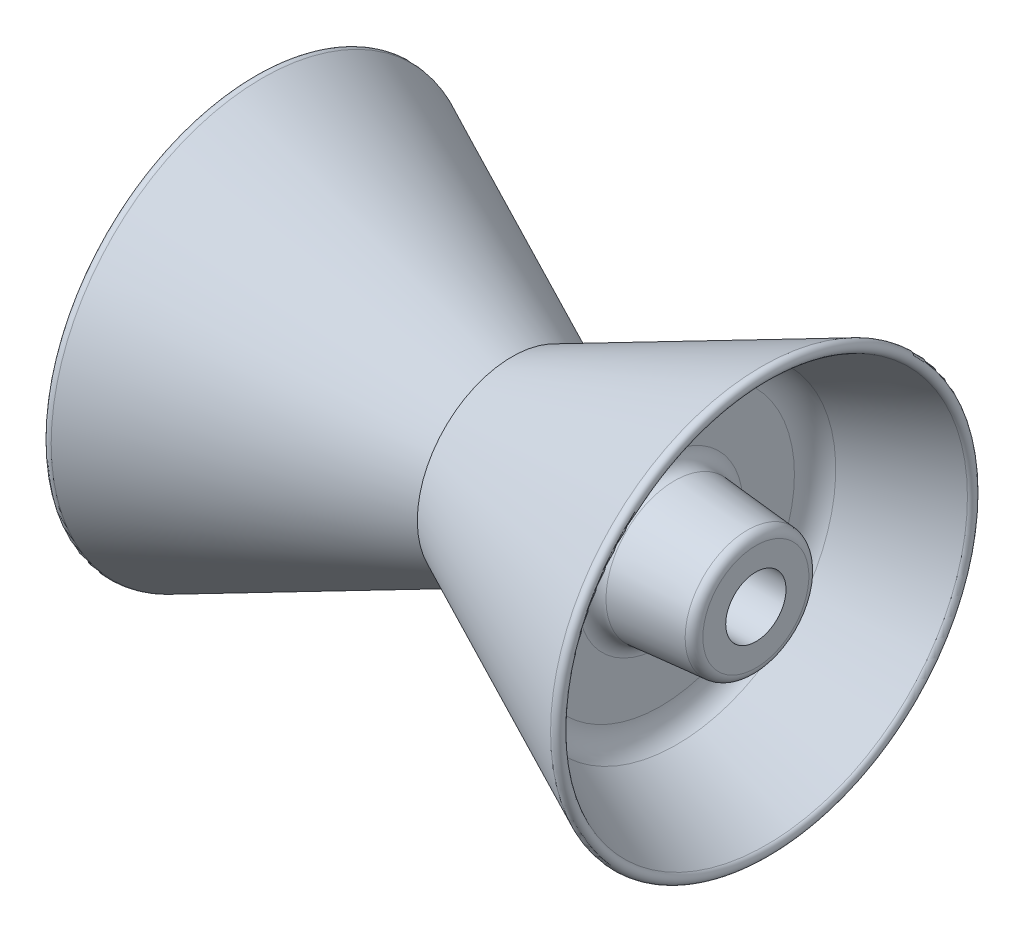
ISO-10303-21;
HEADER;
FILE_DESCRIPTION(('STEP AP214'),'2;1');
FILE_NAME('part.step','',(''),(''),'','','');
FILE_SCHEMA(('AUTOMOTIVE_DESIGN { 1 0 10303 214 1 1 1 1 }'));
ENDSEC;
DATA;
#1=APPLICATION_CONTEXT('core data for automotive mechanical design processes');
#2=APPLICATION_PROTOCOL_DEFINITION('international standard','automotive_design',2000,#1);
#3=PRODUCT_CONTEXT('',#1,'mechanical');
#4=PRODUCT('Part','Part','',(#3));
#5=PRODUCT_RELATED_PRODUCT_CATEGORY('part','',(#4));
#6=PRODUCT_DEFINITION_FORMATION('','',#4);
#7=PRODUCT_DEFINITION_CONTEXT('part definition',#1,'design');
#8=PRODUCT_DEFINITION('design','',#6,#7);
#9=PRODUCT_DEFINITION_SHAPE('','',#8);
#10=(LENGTH_UNIT() NAMED_UNIT(*) SI_UNIT(.MILLI.,.METRE.));
#11=(NAMED_UNIT(*) PLANE_ANGLE_UNIT() SI_UNIT($,.RADIAN.));
#12=(NAMED_UNIT(*) SI_UNIT($,.STERADIAN.) SOLID_ANGLE_UNIT());
#13=UNCERTAINTY_MEASURE_WITH_UNIT(LENGTH_MEASURE(1.E-05),#10,'distance_accuracy_value','');
#14=(GEOMETRIC_REPRESENTATION_CONTEXT(3) GLOBAL_UNCERTAINTY_ASSIGNED_CONTEXT((#13)) GLOBAL_UNIT_ASSIGNED_CONTEXT((#10,
#11,#12)) REPRESENTATION_CONTEXT('',''));
#15=CARTESIAN_POINT('',(0.,0.,0.));
#16=DIRECTION('',(0.,0.,1.));
#17=DIRECTION('',(1.,0.,0.));
#18=AXIS2_PLACEMENT_3D('',#15,#16,#17);
#19=CARTESIAN_POINT('',(0.,-102.016245341434,0.));
#20=DIRECTION('',(-1.,0.,0.));
#21=DIRECTION('',(0.,0.,1.));
#22=AXIS2_PLACEMENT_3D('',#19,#20,#21);
#23=CONICAL_SURFACE('',#22,102.016245341434,0.43633231299858);
#24=CARTESIAN_POINT('',(-269.015,-102.016245341434,0.));
#25=DIRECTION('',(-1.,0.,0.));
#26=DIRECTION('',(0.,0.,1.));
#27=AXIS2_PLACEMENT_3D('',#24,#25,#26);
#28=CIRCLE('',#27,227.46);
#29=CARTESIAN_POINT('',(-269.015,-102.016245341434,227.46));
#30=VERTEX_POINT('',#29);
#31=EDGE_CURVE('E10',#30,#30,#28,.T.);
#32=ORIENTED_EDGE('',*,*,#31,.F.);
#33=EDGE_LOOP('',(#32));
#34=FACE_BOUND('',#33,.T.);
#35=CARTESIAN_POINT('',(0.,-102.016245341434,0.));
#36=DIRECTION('',(-1.,0.,0.));
#37=DIRECTION('',(0.,0.,1.));
#38=AXIS2_PLACEMENT_3D('',#35,#36,#37);
#39=CIRCLE('',#38,102.016245341434);
#40=CARTESIAN_POINT('',(0.,-102.016245341434,102.016245341434));
#41=VERTEX_POINT('',#40);
#42=EDGE_CURVE('E148',#41,#41,#39,.T.);
#43=ORIENTED_EDGE('',*,*,#42,.T.);
#44=EDGE_LOOP('',(#43));
#45=FACE_BOUND('',#44,.T.);
#46=ADVANCED_FACE('F41',(#34,#45),#23,.T.);
#47=CARTESIAN_POINT('',(-271.550709570444,-102.016245341434,0.));
#48=DIRECTION('',(-1.,0.,0.));
#49=DIRECTION('',(0.,0.,1.));
#50=AXIS2_PLACEMENT_3D('',#47,#48,#49);
#51=TOROIDAL_SURFACE('',#50,222.02215327778,6.);
#52=CARTESIAN_POINT('',(-274.086419140888,-102.016245341434,0.));
#53=DIRECTION('',(-1.,0.,0.));
#54=DIRECTION('',(0.,0.,1.));
#55=AXIS2_PLACEMENT_3D('',#52,#53,#54);
#56=CIRCLE('',#55,216.58430655556);
#57=CARTESIAN_POINT('',(-274.086419140888,-102.016245341434,216.58430655556));
#58=VERTEX_POINT('',#57);
#59=EDGE_CURVE('E48',#58,#58,#56,.T.);
#60=ORIENTED_EDGE('',*,*,#59,.F.);
#61=EDGE_LOOP('',(#60));
#62=FACE_BOUND('',#61,.T.);
#63=ORIENTED_EDGE('',*,*,#31,.T.);
#64=EDGE_LOOP('',(#63));
#65=FACE_BOUND('',#64,.T.);
#66=ADVANCED_FACE('F294',(#62,#65),#51,.T.);
#67=CARTESIAN_POINT('',(-274.086419140888,-102.016245341434,0.));
#68=DIRECTION('',(-1.,0.,0.));
#69=DIRECTION('',(0.,0.,1.));
#70=AXIS2_PLACEMENT_3D('',#67,#68,#69);
#71=CONICAL_SURFACE('',#70,216.58430655556,0.43633231299858);
#72=CARTESIAN_POINT('',(-177.321452147779,-102.016245341434,0.));
#73=DIRECTION('',(-1.,0.,0.));
#74=DIRECTION('',(0.,0.,1.));
#75=AXIS2_PLACEMENT_3D('',#72,#73,#74);
#76=CIRCLE('',#75,171.462061405558);
#77=CARTESIAN_POINT('',(-177.321452147779,-102.016245341434,171.462061405558));
#78=VERTEX_POINT('',#77);
#79=EDGE_CURVE('E53',#78,#78,#76,.T.);
#80=ORIENTED_EDGE('',*,*,#79,.F.);
#81=EDGE_LOOP('',(#80));
#82=FACE_BOUND('',#81,.T.);
#83=ORIENTED_EDGE('',*,*,#59,.T.);
#84=EDGE_LOOP('',(#83));
#85=FACE_BOUND('',#84,.T.);
#86=ADVANCED_FACE('F289',(#82,#85),#71,.F.);
#87=CARTESIAN_POINT('',(-190.,-102.016245341434,0.));
#88=DIRECTION('',(-1.,0.,0.));
#89=DIRECTION('',(0.,0.,1.));
#90=AXIS2_PLACEMENT_3D('',#87,#88,#89);
#91=TOROIDAL_SURFACE('',#90,144.272827794458,30.);
#92=CARTESIAN_POINT('',(-160.,-102.016245341434,0.));
#93=DIRECTION('',(-1.,0.,0.));
#94=DIRECTION('',(0.,0.,1.));
#95=AXIS2_PLACEMENT_3D('',#92,#93,#94);
#96=CIRCLE('',#95,144.272827794458);
#97=CARTESIAN_POINT('',(-160.,-102.016245341434,144.272827794458));
#98=VERTEX_POINT('',#97);
#99=EDGE_CURVE('E58',#98,#98,#96,.T.);
#100=ORIENTED_EDGE('',*,*,#99,.F.);
#101=EDGE_LOOP('',(#100));
#102=FACE_BOUND('',#101,.T.);
#103=ORIENTED_EDGE('',*,*,#79,.T.);
#104=EDGE_LOOP('',(#103));
#105=FACE_BOUND('',#104,.T.);
#106=ADVANCED_FACE('F283',(#102,#105),#91,.F.);
#107=CARTESIAN_POINT('',(-160.,42.2565824530244,0.));
#108=DIRECTION('',(1.,0.,0.));
#109=DIRECTION('',(0.,0.,-1.));
#110=AXIS2_PLACEMENT_3D('',#107,#108,#109);
#111=PLANE('',#110);
#112=CARTESIAN_POINT('',(-160.,-102.016245341434,0.));
#113=DIRECTION('',(-1.,0.,0.));
#114=DIRECTION('',(0.,0.,1.));
#115=AXIS2_PLACEMENT_3D('',#112,#113,#114);
#116=CIRCLE('',#115,88.775710313884);
#117=CARTESIAN_POINT('',(-160.,-102.016245341434,88.775710313884));
#118=VERTEX_POINT('',#117);
#119=EDGE_CURVE('E64',#118,#118,#116,.T.);
#120=ORIENTED_EDGE('',*,*,#119,.F.);
#121=EDGE_LOOP('',(#120));
#122=FACE_BOUND('',#121,.T.);
#123=ORIENTED_EDGE('',*,*,#99,.T.);
#124=EDGE_LOOP('',(#123));
#125=FACE_BOUND('',#124,.T.);
#126=ADVANCED_FACE('F277',(#122,#125),#111,.F.);
#127=CARTESIAN_POINT('',(-175.,-102.016245341434,0.));
#128=DIRECTION('',(-1.,0.,0.));
#129=DIRECTION('',(0.,0.,1.));
#130=AXIS2_PLACEMENT_3D('',#127,#128,#129);
#131=TOROIDAL_SURFACE('',#130,88.775710313884,15.);
#132=CARTESIAN_POINT('',(-175.,-102.016245341434,0.));
#133=DIRECTION('',(-1.,0.,0.));
#134=DIRECTION('',(0.,0.,1.));
#135=AXIS2_PLACEMENT_3D('',#132,#133,#134);
#136=CIRCLE('',#135,73.775710313884);
#137=CARTESIAN_POINT('',(-175.,-102.016245341434,73.775710313884));
#138=VERTEX_POINT('',#137);
#139=EDGE_CURVE('E68',#138,#138,#136,.T.);
#140=ORIENTED_EDGE('',*,*,#139,.F.);
#141=EDGE_LOOP('',(#140));
#142=FACE_BOUND('',#141,.T.);
#143=ORIENTED_EDGE('',*,*,#119,.T.);
#144=EDGE_LOOP('',(#143));
#145=FACE_BOUND('',#144,.T.);
#146=ADVANCED_FACE('F271',(#142,#145),#131,.F.);
#147=CARTESIAN_POINT('',(-175.,-102.016245341434,0.));
#148=DIRECTION('',(1.,0.,0.));
#149=DIRECTION('',(0.,0.,-1.));
#150=AXIS2_PLACEMENT_3D('',#147,#148,#149);
#151=CONICAL_SURFACE('',#150,73.775710313884,0.0852732270800067);
#152=CARTESIAN_POINT('',(-253.59098888883,-102.016245341434,0.));
#153=DIRECTION('',(-1.,0.,0.));
#154=DIRECTION('',(0.,0.,1.));
#155=AXIS2_PLACEMENT_3D('',#152,#153,#154);
#156=CIRCLE('',#155,67.0577118120168);
#157=CARTESIAN_POINT('',(-253.59098888883,-102.016245341434,67.0577118120168));
#158=VERTEX_POINT('',#157);
#159=EDGE_CURVE('E72',#158,#158,#156,.T.);
#160=ORIENTED_EDGE('',*,*,#159,.F.);
#161=EDGE_LOOP('',(#160));
#162=FACE_BOUND('',#161,.T.);
#163=ORIENTED_EDGE('',*,*,#139,.T.);
#164=EDGE_LOOP('',(#163));
#165=FACE_BOUND('',#164,.T.);
#166=ADVANCED_FACE('F265',(#162,#165),#151,.T.);
#167=CARTESIAN_POINT('',(-252.739289686116,-102.016245341434,0.));
#168=DIRECTION('',(-1.,0.,0.));
#169=DIRECTION('',(0.,0.,1.));
#170=AXIS2_PLACEMENT_3D('',#167,#168,#169);
#171=TOROIDAL_SURFACE('',#170,57.0940474023683,10.);
#172=CARTESIAN_POINT('',(-262.739289686116,-102.016245341434,0.));
#173=DIRECTION('',(-1.,0.,0.));
#174=DIRECTION('',(0.,0.,1.));
#175=AXIS2_PLACEMENT_3D('',#172,#173,#174);
#176=CIRCLE('',#175,57.0940474023682);
#177=CARTESIAN_POINT('',(-262.739289686116,-102.016245341434,57.0940474023682));
#178=VERTEX_POINT('',#177);
#179=EDGE_CURVE('E76',#178,#178,#176,.T.);
#180=ORIENTED_EDGE('',*,*,#179,.F.);
#181=EDGE_LOOP('',(#180));
#182=FACE_BOUND('',#181,.T.);
#183=ORIENTED_EDGE('',*,*,#159,.T.);
#184=EDGE_LOOP('',(#183));
#185=FACE_BOUND('',#184,.T.);
#186=ADVANCED_FACE('F259',(#182,#185),#171,.T.);
#187=CARTESIAN_POINT('',(-262.739289686116,-44.9221979390657,0.));
#188=DIRECTION('',(1.,0.,0.));
#189=DIRECTION('',(0.,0.,-1.));
#190=AXIS2_PLACEMENT_3D('',#187,#188,#189);
#191=PLANE('',#190);
#192=CARTESIAN_POINT('',(-262.739289686116,-102.016245341434,0.));
#193=DIRECTION('',(-1.,0.,0.));
#194=DIRECTION('',(0.,0.,1.));
#195=AXIS2_PLACEMENT_3D('',#192,#193,#194);
#196=CIRCLE('',#195,32.5);
#197=CARTESIAN_POINT('',(-262.739289686116,-102.016245341434,32.5));
#198=VERTEX_POINT('',#197);
#199=EDGE_CURVE('E80',#198,#198,#196,.T.);
#200=ORIENTED_EDGE('',*,*,#199,.F.);
#201=EDGE_LOOP('',(#200));
#202=FACE_BOUND('',#201,.T.);
#203=ORIENTED_EDGE('',*,*,#179,.T.);
#204=EDGE_LOOP('',(#203));
#205=FACE_BOUND('',#204,.T.);
#206=ADVANCED_FACE('F253',(#202,#205),#191,.F.);
#207=CARTESIAN_POINT('',(-336.886996408416,-102.016245341434,0.));
#208=DIRECTION('',(-1.,0.,0.));
#209=DIRECTION('',(0.,0.,1.));
#210=AXIS2_PLACEMENT_3D('',#207,#208,#209);
#211=CYLINDRICAL_SURFACE('',#210,32.5);
#212=CARTESIAN_POINT('',(-130.,-102.016245341434,0.));
#213=DIRECTION('',(-1.,0.,0.));
#214=DIRECTION('',(0.,0.,1.));
#215=AXIS2_PLACEMENT_3D('',#212,#213,#214);
#216=CIRCLE('',#215,32.5);
#217=CARTESIAN_POINT('',(-130.,-102.016245341434,32.5));
#218=VERTEX_POINT('',#217);
#219=EDGE_CURVE('E84',#218,#218,#216,.T.);
#220=ORIENTED_EDGE('',*,*,#219,.F.);
#221=EDGE_LOOP('',(#220));
#222=FACE_BOUND('',#221,.T.);
#223=ORIENTED_EDGE('',*,*,#199,.T.);
#224=EDGE_LOOP('',(#223));
#225=FACE_BOUND('',#224,.T.);
#226=ADVANCED_FACE('F247',(#222,#225),#211,.F.);
#227=CARTESIAN_POINT('',(-130.,0.288893219074583,0.));
#228=DIRECTION('',(-1.,0.,0.));
#229=DIRECTION('',(0.,0.,1.));
#230=AXIS2_PLACEMENT_3D('',#227,#228,#229);
#231=PLANE('',#230);
#232=CARTESIAN_POINT('',(-130.,-102.016245341434,0.));
#233=DIRECTION('',(-1.,0.,0.));
#234=DIRECTION('',(0.,0.,1.));
#235=AXIS2_PLACEMENT_3D('',#232,#233,#234);
#236=CIRCLE('',#235,102.305138560508);
#237=CARTESIAN_POINT('',(-130.,-102.016245341434,102.305138560508));
#238=VERTEX_POINT('',#237);
#239=EDGE_CURVE('E88',#238,#238,#236,.T.);
#240=ORIENTED_EDGE('',*,*,#239,.F.);
#241=EDGE_LOOP('',(#240));
#242=FACE_BOUND('',#241,.T.);
#243=ORIENTED_EDGE('',*,*,#219,.T.);
#244=EDGE_LOOP('',(#243));
#245=FACE_BOUND('',#244,.T.);
#246=ADVANCED_FACE('F241',(#242,#245),#231,.F.);
#247=CARTESIAN_POINT('',(-100.,-102.016245341434,0.));
#248=DIRECTION('',(-1.,0.,0.));
#249=DIRECTION('',(0.,0.,1.));
#250=AXIS2_PLACEMENT_3D('',#247,#248,#249);
#251=TOROIDAL_SURFACE('',#250,102.305138560509,30.);
#252=CARTESIAN_POINT('',(-87.3214521477788,-102.016245341434,0.));
#253=DIRECTION('',(-1.,0.,0.));
#254=DIRECTION('',(0.,0.,1.));
#255=AXIS2_PLACEMENT_3D('',#252,#253,#254);
#256=CIRCLE('',#255,129.494372171608);
#257=CARTESIAN_POINT('',(-87.3214521477788,-102.016245341434,129.494372171608));
#258=VERTEX_POINT('',#257);
#259=EDGE_CURVE('E92',#258,#258,#256,.T.);
#260=ORIENTED_EDGE('',*,*,#259,.F.);
#261=EDGE_LOOP('',(#260));
#262=FACE_BOUND('',#261,.T.);
#263=ORIENTED_EDGE('',*,*,#239,.T.);
#264=EDGE_LOOP('',(#263));
#265=FACE_BOUND('',#264,.T.);
#266=ADVANCED_FACE('F235',(#262,#265),#251,.F.);
#267=CARTESIAN_POINT('',(-87.3214521477788,-102.016245341434,0.));
#268=DIRECTION('',(-1.,0.,0.));
#269=DIRECTION('',(0.,0.,1.));
#270=AXIS2_PLACEMENT_3D('',#267,#268,#269);
#271=CONICAL_SURFACE('',#270,129.494372171608,0.43633231299858);
#272=CARTESIAN_POINT('',(0.,-102.016245341434,0.));
#273=DIRECTION('',(-1.,0.,0.));
#274=DIRECTION('',(0.,0.,1.));
#275=AXIS2_PLACEMENT_3D('',#272,#273,#274);
#276=CIRCLE('',#275,88.775710313884);
#277=CARTESIAN_POINT('',(0.,-102.016245341434,88.775710313884));
#278=VERTEX_POINT('',#277);
#279=EDGE_CURVE('E96',#278,#278,#276,.T.);
#280=ORIENTED_EDGE('',*,*,#279,.F.);
#281=EDGE_LOOP('',(#280));
#282=FACE_BOUND('',#281,.T.);
#283=ORIENTED_EDGE('',*,*,#259,.T.);
#284=EDGE_LOOP('',(#283));
#285=FACE_BOUND('',#284,.T.);
#286=ADVANCED_FACE('F229',(#282,#285),#271,.F.);
#287=CARTESIAN_POINT('',(0.,-102.016245341434,0.));
#288=DIRECTION('',(1.,0.,0.));
#289=DIRECTION('',(0.,0.,-1.));
#290=AXIS2_PLACEMENT_3D('',#287,#288,#289);
#291=CONICAL_SURFACE('',#290,88.775710313884,0.43633231299858);
#292=CARTESIAN_POINT('',(87.3214521477788,-102.016245341434,0.));
#293=DIRECTION('',(-1.,0.,0.));
#294=DIRECTION('',(0.,0.,1.));
#295=AXIS2_PLACEMENT_3D('',#292,#293,#294);
#296=CIRCLE('',#295,129.494372171608);
#297=CARTESIAN_POINT('',(87.3214521477788,-102.016245341434,129.494372171608));
#298=VERTEX_POINT('',#297);
#299=EDGE_CURVE('E100',#298,#298,#296,.T.);
#300=ORIENTED_EDGE('',*,*,#299,.F.);
#301=EDGE_LOOP('',(#300));
#302=FACE_BOUND('',#301,.T.);
#303=ORIENTED_EDGE('',*,*,#279,.T.);
#304=EDGE_LOOP('',(#303));
#305=FACE_BOUND('',#304,.T.);
#306=ADVANCED_FACE('F223',(#302,#305),#291,.F.);
#307=CARTESIAN_POINT('',(100.,-102.016245341434,0.));
#308=DIRECTION('',(-1.,0.,0.));
#309=DIRECTION('',(0.,0.,1.));
#310=AXIS2_PLACEMENT_3D('',#307,#308,#309);
#311=TOROIDAL_SURFACE('',#310,102.305138560509,30.);
#312=CARTESIAN_POINT('',(130.,-102.016245341434,0.));
#313=DIRECTION('',(-1.,0.,0.));
#314=DIRECTION('',(0.,0.,1.));
#315=AXIS2_PLACEMENT_3D('',#312,#313,#314);
#316=CIRCLE('',#315,102.305138560508);
#317=CARTESIAN_POINT('',(130.,-102.016245341434,102.305138560508));
#318=VERTEX_POINT('',#317);
#319=EDGE_CURVE('E104',#318,#318,#316,.T.);
#320=ORIENTED_EDGE('',*,*,#319,.F.);
#321=EDGE_LOOP('',(#320));
#322=FACE_BOUND('',#321,.T.);
#323=ORIENTED_EDGE('',*,*,#299,.T.);
#324=EDGE_LOOP('',(#323));
#325=FACE_BOUND('',#324,.T.);
#326=ADVANCED_FACE('F217',(#322,#325),#311,.F.);
#327=CARTESIAN_POINT('',(130.,0.288893219074581,0.));
#328=DIRECTION('',(1.,0.,0.));
#329=DIRECTION('',(0.,0.,-1.));
#330=AXIS2_PLACEMENT_3D('',#327,#328,#329);
#331=PLANE('',#330);
#332=CARTESIAN_POINT('',(130.,-102.016245341434,0.));
#333=DIRECTION('',(-1.,0.,0.));
#334=DIRECTION('',(0.,0.,1.));
#335=AXIS2_PLACEMENT_3D('',#332,#333,#334);
#336=CIRCLE('',#335,32.5);
#337=CARTESIAN_POINT('',(130.,-102.016245341434,32.5));
#338=VERTEX_POINT('',#337);
#339=EDGE_CURVE('E108',#338,#338,#336,.T.);
#340=ORIENTED_EDGE('',*,*,#339,.F.);
#341=EDGE_LOOP('',(#340));
#342=FACE_BOUND('',#341,.T.);
#343=ORIENTED_EDGE('',*,*,#319,.T.);
#344=EDGE_LOOP('',(#343));
#345=FACE_BOUND('',#344,.T.);
#346=ADVANCED_FACE('F211',(#342,#345),#331,.F.);
#347=CARTESIAN_POINT('',(-336.886996408416,-102.016245341434,0.));
#348=DIRECTION('',(-1.,0.,0.));
#349=DIRECTION('',(0.,0.,1.));
#350=AXIS2_PLACEMENT_3D('',#347,#348,#349);
#351=CYLINDRICAL_SURFACE('',#350,32.5);
#352=CARTESIAN_POINT('',(262.739289686116,-102.016245341434,0.));
#353=DIRECTION('',(-1.,0.,0.));
#354=DIRECTION('',(0.,0.,1.));
#355=AXIS2_PLACEMENT_3D('',#352,#353,#354);
#356=CIRCLE('',#355,32.5);
#357=CARTESIAN_POINT('',(262.739289686116,-102.016245341434,32.5));
#358=VERTEX_POINT('',#357);
#359=EDGE_CURVE('E112',#358,#358,#356,.T.);
#360=ORIENTED_EDGE('',*,*,#359,.F.);
#361=EDGE_LOOP('',(#360));
#362=FACE_BOUND('',#361,.T.);
#363=ORIENTED_EDGE('',*,*,#339,.T.);
#364=EDGE_LOOP('',(#363));
#365=FACE_BOUND('',#364,.T.);
#366=ADVANCED_FACE('F205',(#362,#365),#351,.F.);
#367=CARTESIAN_POINT('',(262.739289686116,-44.9221979390657,0.));
#368=DIRECTION('',(-1.,0.,0.));
#369=DIRECTION('',(0.,0.,1.));
#370=AXIS2_PLACEMENT_3D('',#367,#368,#369);
#371=PLANE('',#370);
#372=CARTESIAN_POINT('',(262.739289686116,-102.016245341434,0.));
#373=DIRECTION('',(-1.,0.,0.));
#374=DIRECTION('',(0.,0.,1.));
#375=AXIS2_PLACEMENT_3D('',#372,#373,#374);
#376=CIRCLE('',#375,57.0940474023682);
#377=CARTESIAN_POINT('',(262.739289686116,-102.016245341434,57.0940474023682));
#378=VERTEX_POINT('',#377);
#379=EDGE_CURVE('E116',#378,#378,#376,.T.);
#380=ORIENTED_EDGE('',*,*,#379,.F.);
#381=EDGE_LOOP('',(#380));
#382=FACE_BOUND('',#381,.T.);
#383=ORIENTED_EDGE('',*,*,#359,.T.);
#384=EDGE_LOOP('',(#383));
#385=FACE_BOUND('',#384,.T.);
#386=ADVANCED_FACE('F199',(#382,#385),#371,.F.);
#387=CARTESIAN_POINT('',(252.739289686116,-102.016245341434,0.));
#388=DIRECTION('',(-1.,0.,0.));
#389=DIRECTION('',(0.,0.,1.));
#390=AXIS2_PLACEMENT_3D('',#387,#388,#389);
#391=TOROIDAL_SURFACE('',#390,57.0940474023683,10.);
#392=CARTESIAN_POINT('',(253.59098888883,-102.016245341434,0.));
#393=DIRECTION('',(-1.,0.,0.));
#394=DIRECTION('',(0.,0.,1.));
#395=AXIS2_PLACEMENT_3D('',#392,#393,#394);
#396=CIRCLE('',#395,67.0577118120168);
#397=CARTESIAN_POINT('',(253.59098888883,-102.016245341434,67.0577118120168));
#398=VERTEX_POINT('',#397);
#399=EDGE_CURVE('E120',#398,#398,#396,.T.);
#400=ORIENTED_EDGE('',*,*,#399,.F.);
#401=EDGE_LOOP('',(#400));
#402=FACE_BOUND('',#401,.T.);
#403=ORIENTED_EDGE('',*,*,#379,.T.);
#404=EDGE_LOOP('',(#403));
#405=FACE_BOUND('',#404,.T.);
#406=ADVANCED_FACE('F193',(#402,#405),#391,.T.);
#407=CARTESIAN_POINT('',(253.59098888883,-102.016245341434,0.));
#408=DIRECTION('',(-1.,0.,0.));
#409=DIRECTION('',(0.,0.,1.));
#410=AXIS2_PLACEMENT_3D('',#407,#408,#409);
#411=CONICAL_SURFACE('',#410,67.0577118120168,0.085273227080007);
#412=CARTESIAN_POINT('',(175.,-102.016245341434,0.));
#413=DIRECTION('',(-1.,0.,0.));
#414=DIRECTION('',(0.,0.,1.));
#415=AXIS2_PLACEMENT_3D('',#412,#413,#414);
#416=CIRCLE('',#415,73.775710313884);
#417=CARTESIAN_POINT('',(175.,-102.016245341434,73.775710313884));
#418=VERTEX_POINT('',#417);
#419=EDGE_CURVE('E124',#418,#418,#416,.T.);
#420=ORIENTED_EDGE('',*,*,#419,.F.);
#421=EDGE_LOOP('',(#420));
#422=FACE_BOUND('',#421,.T.);
#423=ORIENTED_EDGE('',*,*,#399,.T.);
#424=EDGE_LOOP('',(#423));
#425=FACE_BOUND('',#424,.T.);
#426=ADVANCED_FACE('F187',(#422,#425),#411,.T.);
#427=CARTESIAN_POINT('',(175.,-102.016245341434,0.));
#428=DIRECTION('',(-1.,0.,0.));
#429=DIRECTION('',(0.,0.,1.));
#430=AXIS2_PLACEMENT_3D('',#427,#428,#429);
#431=TOROIDAL_SURFACE('',#430,88.775710313884,15.);
#432=CARTESIAN_POINT('',(160.,-102.016245341434,0.));
#433=DIRECTION('',(-1.,0.,0.));
#434=DIRECTION('',(0.,0.,1.));
#435=AXIS2_PLACEMENT_3D('',#432,#433,#434);
#436=CIRCLE('',#435,88.775710313884);
#437=CARTESIAN_POINT('',(160.,-102.016245341434,88.775710313884));
#438=VERTEX_POINT('',#437);
#439=EDGE_CURVE('E128',#438,#438,#436,.T.);
#440=ORIENTED_EDGE('',*,*,#439,.F.);
#441=EDGE_LOOP('',(#440));
#442=FACE_BOUND('',#441,.T.);
#443=ORIENTED_EDGE('',*,*,#419,.T.);
#444=EDGE_LOOP('',(#443));
#445=FACE_BOUND('',#444,.T.);
#446=ADVANCED_FACE('F181',(#442,#445),#431,.F.);
#447=CARTESIAN_POINT('',(160.,42.2565824530244,0.));
#448=DIRECTION('',(-1.,0.,0.));
#449=DIRECTION('',(0.,0.,1.));
#450=AXIS2_PLACEMENT_3D('',#447,#448,#449);
#451=PLANE('',#450);
#452=CARTESIAN_POINT('',(160.,-102.016245341434,0.));
#453=DIRECTION('',(-1.,0.,0.));
#454=DIRECTION('',(0.,0.,1.));
#455=AXIS2_PLACEMENT_3D('',#452,#453,#454);
#456=CIRCLE('',#455,144.272827794458);
#457=CARTESIAN_POINT('',(160.,-102.016245341434,144.272827794458));
#458=VERTEX_POINT('',#457);
#459=EDGE_CURVE('E132',#458,#458,#456,.T.);
#460=ORIENTED_EDGE('',*,*,#459,.F.);
#461=EDGE_LOOP('',(#460));
#462=FACE_BOUND('',#461,.T.);
#463=ORIENTED_EDGE('',*,*,#439,.T.);
#464=EDGE_LOOP('',(#463));
#465=FACE_BOUND('',#464,.T.);
#466=ADVANCED_FACE('F175',(#462,#465),#451,.F.);
#467=CARTESIAN_POINT('',(190.,-102.016245341434,0.));
#468=DIRECTION('',(-1.,0.,0.));
#469=DIRECTION('',(0.,0.,1.));
#470=AXIS2_PLACEMENT_3D('',#467,#468,#469);
#471=TOROIDAL_SURFACE('',#470,144.272827794458,30.);
#472=CARTESIAN_POINT('',(177.321452147779,-102.016245341434,0.));
#473=DIRECTION('',(-1.,0.,0.));
#474=DIRECTION('',(0.,0.,1.));
#475=AXIS2_PLACEMENT_3D('',#472,#473,#474);
#476=CIRCLE('',#475,171.462061405558);
#477=CARTESIAN_POINT('',(177.321452147779,-102.016245341434,171.462061405558));
#478=VERTEX_POINT('',#477);
#479=EDGE_CURVE('E136',#478,#478,#476,.T.);
#480=ORIENTED_EDGE('',*,*,#479,.F.);
#481=EDGE_LOOP('',(#480));
#482=FACE_BOUND('',#481,.T.);
#483=ORIENTED_EDGE('',*,*,#459,.T.);
#484=EDGE_LOOP('',(#483));
#485=FACE_BOUND('',#484,.T.);
#486=ADVANCED_FACE('F169',(#482,#485),#471,.F.);
#487=CARTESIAN_POINT('',(177.321452147779,-102.016245341434,0.));
#488=DIRECTION('',(1.,0.,0.));
#489=DIRECTION('',(0.,0.,-1.));
#490=AXIS2_PLACEMENT_3D('',#487,#488,#489);
#491=CONICAL_SURFACE('',#490,171.462061405558,0.43633231299858);
#492=CARTESIAN_POINT('',(274.086419140888,-102.016245341434,0.));
#493=DIRECTION('',(-1.,0.,0.));
#494=DIRECTION('',(0.,0.,1.));
#495=AXIS2_PLACEMENT_3D('',#492,#493,#494);
#496=CIRCLE('',#495,216.58430655556);
#497=CARTESIAN_POINT('',(274.086419140888,-102.016245341434,216.58430655556));
#498=VERTEX_POINT('',#497);
#499=EDGE_CURVE('E140',#498,#498,#496,.T.);
#500=ORIENTED_EDGE('',*,*,#499,.F.);
#501=EDGE_LOOP('',(#500));
#502=FACE_BOUND('',#501,.T.);
#503=ORIENTED_EDGE('',*,*,#479,.T.);
#504=EDGE_LOOP('',(#503));
#505=FACE_BOUND('',#504,.T.);
#506=ADVANCED_FACE('F163',(#502,#505),#491,.F.);
#507=CARTESIAN_POINT('',(271.550709570444,-102.016245341434,0.));
#508=DIRECTION('',(-1.,0.,0.));
#509=DIRECTION('',(0.,0.,1.));
#510=AXIS2_PLACEMENT_3D('',#507,#508,#509);
#511=TOROIDAL_SURFACE('',#510,222.02215327778,6.);
#512=CARTESIAN_POINT('',(269.015,-102.016245341434,0.));
#513=DIRECTION('',(-1.,0.,0.));
#514=DIRECTION('',(0.,0.,1.));
#515=AXIS2_PLACEMENT_3D('',#512,#513,#514);
#516=CIRCLE('',#515,227.46);
#517=CARTESIAN_POINT('',(269.015,-102.016245341434,227.46));
#518=VERTEX_POINT('',#517);
#519=EDGE_CURVE('E144',#518,#518,#516,.T.);
#520=ORIENTED_EDGE('',*,*,#519,.F.);
#521=EDGE_LOOP('',(#520));
#522=FACE_BOUND('',#521,.T.);
#523=ORIENTED_EDGE('',*,*,#499,.T.);
#524=EDGE_LOOP('',(#523));
#525=FACE_BOUND('',#524,.T.);
#526=ADVANCED_FACE('F157',(#522,#525),#511,.T.);
#527=CARTESIAN_POINT('',(269.015,-102.016245341434,0.));
#528=DIRECTION('',(1.,0.,0.));
#529=DIRECTION('',(0.,0.,-1.));
#530=AXIS2_PLACEMENT_3D('',#527,#528,#529);
#531=CONICAL_SURFACE('',#530,227.46,0.43633231299858);
#532=ORIENTED_EDGE('',*,*,#42,.F.);
#533=EDGE_LOOP('',(#532));
#534=FACE_BOUND('',#533,.T.);
#535=ORIENTED_EDGE('',*,*,#519,.T.);
#536=EDGE_LOOP('',(#535));
#537=FACE_BOUND('',#536,.T.);
#538=ADVANCED_FACE('F154',(#534,#537),#531,.T.);
#539=CLOSED_SHELL('',(#46,#66,#86,#106,#126,#146,#166,#186,#206,#226,#246,#266,#286,#306,#326,
#346,#366,#386,#406,#426,#446,#466,#486,#506,#526,#538));
#540=MANIFOLD_SOLID_BREP('B2',#539);
#541=ADVANCED_BREP_SHAPE_REPRESENTATION('',(#18,#540),#14);
#542=SHAPE_DEFINITION_REPRESENTATION(#9,#541);
ENDSEC;
END-ISO-10303-21;
